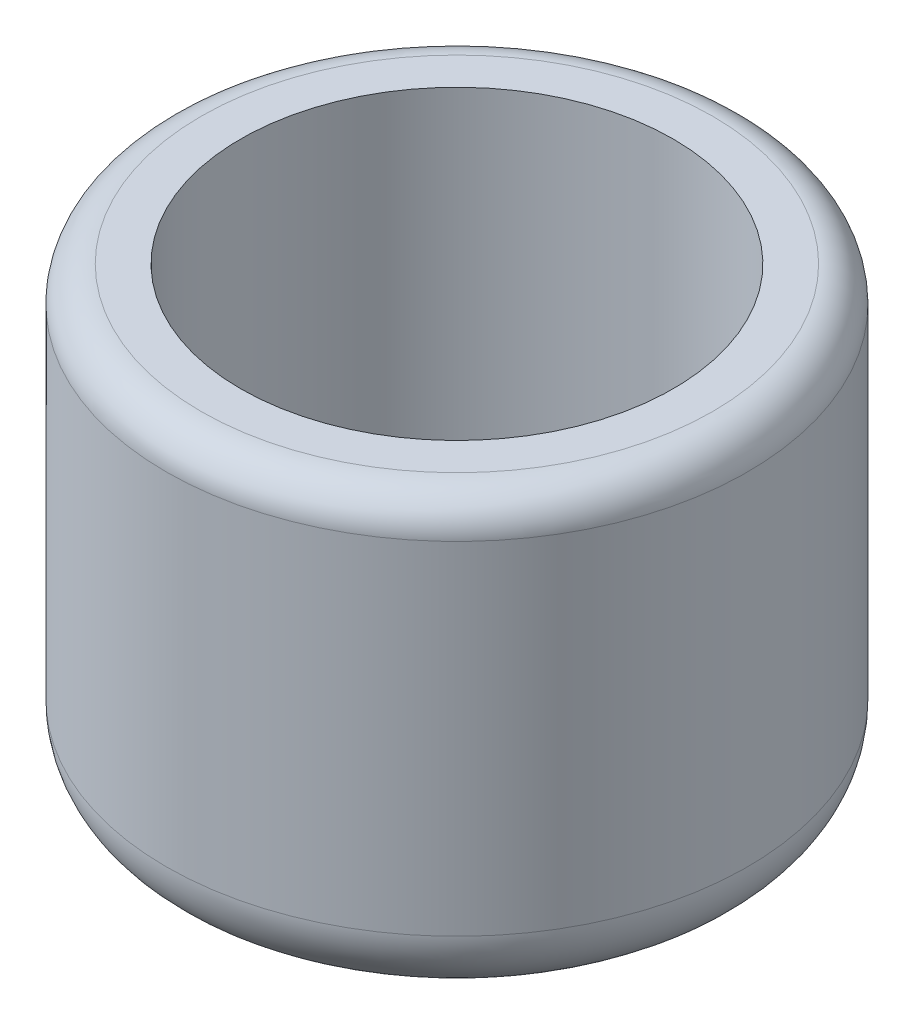
ISO-10303-21;
HEADER;
FILE_DESCRIPTION(('STEP AP214'),'2;1');
FILE_NAME('part.step','',(''),(''),'','','');
FILE_SCHEMA(('AUTOMOTIVE_DESIGN { 1 0 10303 214 1 1 1 1 }'));
ENDSEC;
DATA;
#1=APPLICATION_CONTEXT('core data for automotive mechanical design processes');
#2=APPLICATION_PROTOCOL_DEFINITION('international standard','automotive_design',2000,#1);
#3=PRODUCT_CONTEXT('',#1,'mechanical');
#4=PRODUCT('Part','Part','',(#3));
#5=PRODUCT_RELATED_PRODUCT_CATEGORY('part','',(#4));
#6=PRODUCT_DEFINITION_FORMATION('','',#4);
#7=PRODUCT_DEFINITION_CONTEXT('part definition',#1,'design');
#8=PRODUCT_DEFINITION('design','',#6,#7);
#9=PRODUCT_DEFINITION_SHAPE('','',#8);
#10=(LENGTH_UNIT() NAMED_UNIT(*) SI_UNIT(.MILLI.,.METRE.));
#11=(NAMED_UNIT(*) PLANE_ANGLE_UNIT() SI_UNIT($,.RADIAN.));
#12=(NAMED_UNIT(*) SI_UNIT($,.STERADIAN.) SOLID_ANGLE_UNIT());
#13=UNCERTAINTY_MEASURE_WITH_UNIT(LENGTH_MEASURE(1.E-05),#10,'distance_accuracy_value','');
#14=(GEOMETRIC_REPRESENTATION_CONTEXT(3) GLOBAL_UNCERTAINTY_ASSIGNED_CONTEXT((#13)) GLOBAL_UNIT_ASSIGNED_CONTEXT((#10,
#11,#12)) REPRESENTATION_CONTEXT('',''));
#15=CARTESIAN_POINT('',(0.,0.,0.));
#16=DIRECTION('',(0.,0.,1.));
#17=DIRECTION('',(1.,0.,0.));
#18=AXIS2_PLACEMENT_3D('',#15,#16,#17);
#19=CARTESIAN_POINT('',(0.,16.256,0.));
#20=DIRECTION('',(0.,-1.,0.));
#21=DIRECTION('',(0.,0.,-1.));
#22=AXIS2_PLACEMENT_3D('',#19,#20,#21);
#23=CYLINDRICAL_SURFACE('',#22,10.5791);
#24=CARTESIAN_POINT('',(0.,2.54,0.));
#25=DIRECTION('',(0.,1.,0.));
#26=DIRECTION('',(0.,0.,1.));
#27=AXIS2_PLACEMENT_3D('',#24,#25,#26);
#28=CIRCLE('',#27,10.5791);
#29=CARTESIAN_POINT('',(0.,2.54,10.5791));
#30=VERTEX_POINT('',#29);
#31=EDGE_CURVE('E40',#30,#30,#28,.T.);
#32=ORIENTED_EDGE('',*,*,#31,.T.);
#33=EDGE_LOOP('',(#32));
#34=FACE_BOUND('',#33,.T.);
#35=CARTESIAN_POINT('',(0.,14.986,0.));
#36=DIRECTION('',(0.,1.,0.));
#37=DIRECTION('',(0.,0.,1.));
#38=AXIS2_PLACEMENT_3D('',#35,#36,#37);
#39=CIRCLE('',#38,10.5791);
#40=CARTESIAN_POINT('',(0.,14.986,10.5791));
#41=VERTEX_POINT('',#40);
#42=EDGE_CURVE('E44',#41,#41,#39,.F.);
#43=ORIENTED_EDGE('',*,*,#42,.T.);
#44=EDGE_LOOP('',(#43));
#45=FACE_BOUND('',#44,.T.);
#46=ADVANCED_FACE('F33',(#34,#45),#23,.T.);
#47=CARTESIAN_POINT('',(0.,16.256,0.));
#48=DIRECTION('',(0.,1.,0.));
#49=DIRECTION('',(0.,0.,1.));
#50=AXIS2_PLACEMENT_3D('',#47,#48,#49);
#51=PLANE('',#50);
#52=CARTESIAN_POINT('',(0.,16.256,0.));
#53=DIRECTION('',(0.,1.,0.));
#54=DIRECTION('',(0.,0.,1.));
#55=AXIS2_PLACEMENT_3D('',#52,#53,#54);
#56=CIRCLE('',#55,9.3091);
#57=CARTESIAN_POINT('',(0.,16.256,9.3091));
#58=VERTEX_POINT('',#57);
#59=EDGE_CURVE('E48',#58,#58,#56,.T.);
#60=ORIENTED_EDGE('',*,*,#59,.T.);
#61=EDGE_LOOP('',(#60));
#62=FACE_BOUND('',#61,.T.);
#63=CARTESIAN_POINT('',(0.,16.256,0.));
#64=DIRECTION('',(0.,1.,0.));
#65=DIRECTION('',(0.,0.,1.));
#66=AXIS2_PLACEMENT_3D('',#63,#64,#65);
#67=CIRCLE('',#66,7.874);
#68=CARTESIAN_POINT('',(0.,16.256,7.874));
#69=VERTEX_POINT('',#68);
#70=EDGE_CURVE('E54',#69,#69,#67,.T.);
#71=ORIENTED_EDGE('',*,*,#70,.F.);
#72=EDGE_LOOP('',(#71));
#73=FACE_BOUND('',#72,.T.);
#74=ADVANCED_FACE('F87',(#62,#73),#51,.T.);
#75=CARTESIAN_POINT('',(0.,0.,0.));
#76=DIRECTION('',(0.,1.,0.));
#77=DIRECTION('',(0.,0.,1.));
#78=AXIS2_PLACEMENT_3D('',#75,#76,#77);
#79=PLANE('',#78);
#80=CARTESIAN_POINT('',(0.,0.,0.));
#81=DIRECTION('',(0.,1.,0.));
#82=DIRECTION('',(0.,0.,1.));
#83=AXIS2_PLACEMENT_3D('',#80,#81,#82);
#84=CIRCLE('',#83,1.143);
#85=CARTESIAN_POINT('',(0.,0.,1.143));
#86=VERTEX_POINT('',#85);
#87=EDGE_CURVE('E57',#86,#86,#84,.T.);
#88=ORIENTED_EDGE('',*,*,#87,.T.);
#89=EDGE_LOOP('',(#88));
#90=FACE_BOUND('',#89,.T.);
#91=CARTESIAN_POINT('',(0.,0.,0.));
#92=DIRECTION('',(0.,1.,0.));
#93=DIRECTION('',(0.,0.,1.));
#94=AXIS2_PLACEMENT_3D('',#91,#92,#93);
#95=CIRCLE('',#94,8.0391);
#96=CARTESIAN_POINT('',(0.,0.,8.0391));
#97=VERTEX_POINT('',#96);
#98=EDGE_CURVE('E10',#97,#97,#95,.F.);
#99=ORIENTED_EDGE('',*,*,#98,.T.);
#100=EDGE_LOOP('',(#99));
#101=FACE_BOUND('',#100,.T.);
#102=ADVANCED_FACE('F66',(#90,#101),#79,.F.);
#103=CARTESIAN_POINT('',(0.,2.286,0.));
#104=DIRECTION('',(0.,1.,0.));
#105=DIRECTION('',(0.,0.,1.));
#106=AXIS2_PLACEMENT_3D('',#103,#104,#105);
#107=CYLINDRICAL_SURFACE('',#106,7.874);
#108=CARTESIAN_POINT('',(0.,2.286,0.));
#109=DIRECTION('',(0.,1.,0.));
#110=DIRECTION('',(0.,0.,1.));
#111=AXIS2_PLACEMENT_3D('',#108,#109,#110);
#112=CIRCLE('',#111,7.874);
#113=CARTESIAN_POINT('',(0.,2.286,7.874));
#114=VERTEX_POINT('',#113);
#115=EDGE_CURVE('E53',#114,#114,#112,.T.);
#116=ORIENTED_EDGE('',*,*,#115,.F.);
#117=EDGE_LOOP('',(#116));
#118=FACE_BOUND('',#117,.T.);
#119=ORIENTED_EDGE('',*,*,#70,.T.);
#120=EDGE_LOOP('',(#119));
#121=FACE_BOUND('',#120,.T.);
#122=ADVANCED_FACE('F78',(#118,#121),#107,.F.);
#123=CARTESIAN_POINT('',(0.,2.286,0.));
#124=DIRECTION('',(0.,1.,0.));
#125=DIRECTION('',(0.,0.,1.));
#126=AXIS2_PLACEMENT_3D('',#123,#124,#125);
#127=PLANE('',#126);
#128=CARTESIAN_POINT('',(0.,2.286,0.));
#129=DIRECTION('',(0.,1.,0.));
#130=DIRECTION('',(0.,0.,1.));
#131=AXIS2_PLACEMENT_3D('',#128,#129,#130);
#132=CIRCLE('',#131,1.143);
#133=CARTESIAN_POINT('',(0.,2.286,1.143));
#134=VERTEX_POINT('',#133);
#135=EDGE_CURVE('E60',#134,#134,#132,.T.);
#136=ORIENTED_EDGE('',*,*,#135,.F.);
#137=EDGE_LOOP('',(#136));
#138=FACE_BOUND('',#137,.T.);
#139=ORIENTED_EDGE('',*,*,#115,.T.);
#140=EDGE_LOOP('',(#139));
#141=FACE_BOUND('',#140,.T.);
#142=ADVANCED_FACE('F74',(#138,#141),#127,.T.);
#143=CARTESIAN_POINT('',(0.,14.986,0.));
#144=DIRECTION('',(0.,1.,0.));
#145=DIRECTION('',(0.,0.,1.));
#146=AXIS2_PLACEMENT_3D('',#143,#144,#145);
#147=TOROIDAL_SURFACE('',#146,9.3091,1.27);
#148=ORIENTED_EDGE('',*,*,#42,.F.);
#149=EDGE_LOOP('',(#148));
#150=FACE_BOUND('',#149,.T.);
#151=ORIENTED_EDGE('',*,*,#59,.F.);
#152=EDGE_LOOP('',(#151));
#153=FACE_BOUND('',#152,.T.);
#154=ADVANCED_FACE('F77',(#150,#153),#147,.T.);
#155=CARTESIAN_POINT('',(0.,2.54,0.));
#156=DIRECTION('',(0.,1.,0.));
#157=DIRECTION('',(0.,0.,1.));
#158=AXIS2_PLACEMENT_3D('',#155,#156,#157);
#159=TOROIDAL_SURFACE('',#158,8.0391,2.54);
#160=ORIENTED_EDGE('',*,*,#98,.F.);
#161=EDGE_LOOP('',(#160));
#162=FACE_BOUND('',#161,.T.);
#163=ORIENTED_EDGE('',*,*,#31,.F.);
#164=EDGE_LOOP('',(#163));
#165=FACE_BOUND('',#164,.T.);
#166=ADVANCED_FACE('F35',(#162,#165),#159,.T.);
#167=CARTESIAN_POINT('',(0.,0.,0.));
#168=DIRECTION('',(0.,1.,0.));
#169=DIRECTION('',(0.,0.,1.));
#170=AXIS2_PLACEMENT_3D('',#167,#168,#169);
#171=CYLINDRICAL_SURFACE('',#170,1.143);
#172=ORIENTED_EDGE('',*,*,#87,.F.);
#173=EDGE_LOOP('',(#172));
#174=FACE_BOUND('',#173,.T.);
#175=ORIENTED_EDGE('',*,*,#135,.T.);
#176=EDGE_LOOP('',(#175));
#177=FACE_BOUND('',#176,.T.);
#178=ADVANCED_FACE('F68',(#174,#177),#171,.F.);
#179=CLOSED_SHELL('',(#46,#74,#102,#122,#142,#154,#166,#178));
#180=MANIFOLD_SOLID_BREP('B2',#179);
#181=ADVANCED_BREP_SHAPE_REPRESENTATION('',(#18,#180),#14);
#182=SHAPE_DEFINITION_REPRESENTATION(#9,#181);
ENDSEC;
END-ISO-10303-21;
